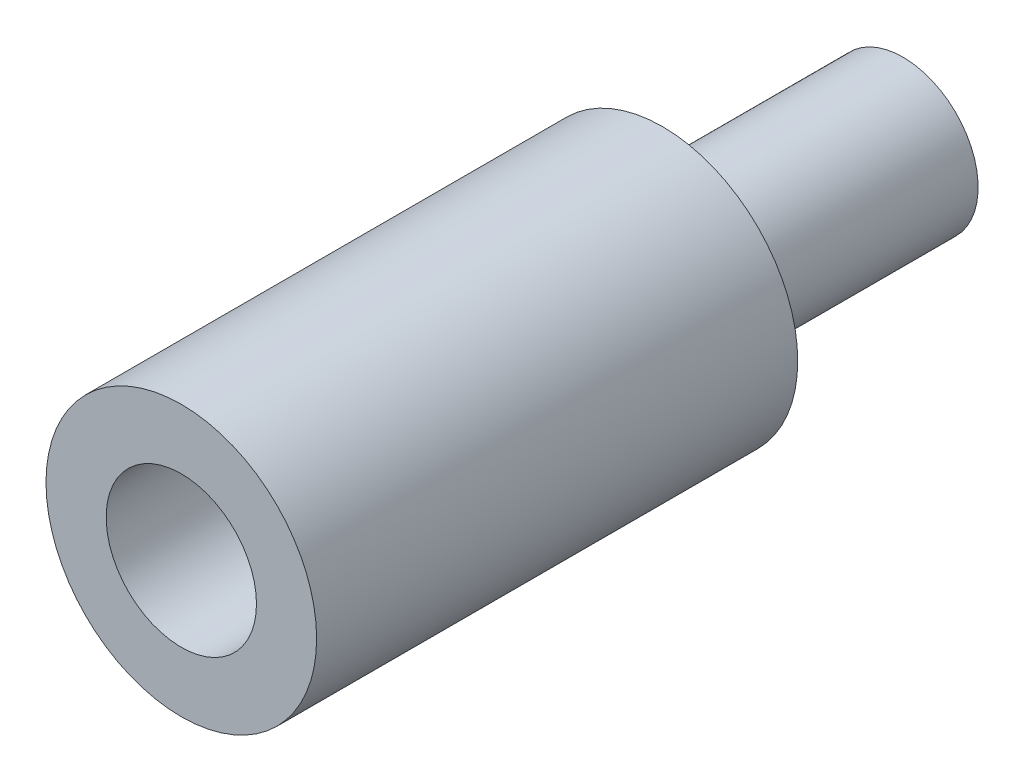
ISO-10303-21;
HEADER;
FILE_DESCRIPTION(('STEP AP214'),'2;1');
FILE_NAME('part.step','',(''),(''),'','','');
FILE_SCHEMA(('AUTOMOTIVE_DESIGN { 1 0 10303 214 1 1 1 1 }'));
ENDSEC;
DATA;
#1=APPLICATION_CONTEXT('core data for automotive mechanical design processes');
#2=APPLICATION_PROTOCOL_DEFINITION('international standard','automotive_design',2000,#1);
#3=PRODUCT_CONTEXT('',#1,'mechanical');
#4=PRODUCT('Part','Part','',(#3));
#5=PRODUCT_RELATED_PRODUCT_CATEGORY('part','',(#4));
#6=PRODUCT_DEFINITION_FORMATION('','',#4);
#7=PRODUCT_DEFINITION_CONTEXT('part definition',#1,'design');
#8=PRODUCT_DEFINITION('design','',#6,#7);
#9=PRODUCT_DEFINITION_SHAPE('','',#8);
#10=(LENGTH_UNIT() NAMED_UNIT(*) SI_UNIT(.MILLI.,.METRE.));
#11=(NAMED_UNIT(*) PLANE_ANGLE_UNIT() SI_UNIT($,.RADIAN.));
#12=(NAMED_UNIT(*) SI_UNIT($,.STERADIAN.) SOLID_ANGLE_UNIT());
#13=UNCERTAINTY_MEASURE_WITH_UNIT(LENGTH_MEASURE(1.E-05),#10,'distance_accuracy_value','');
#14=(GEOMETRIC_REPRESENTATION_CONTEXT(3) GLOBAL_UNCERTAINTY_ASSIGNED_CONTEXT((#13)) GLOBAL_UNIT_ASSIGNED_CONTEXT((#10,
#11,#12)) REPRESENTATION_CONTEXT('',''));
#15=CARTESIAN_POINT('',(0.,0.,0.));
#16=DIRECTION('',(0.,0.,1.));
#17=DIRECTION('',(1.,0.,0.));
#18=AXIS2_PLACEMENT_3D('',#15,#16,#17);
#19=CARTESIAN_POINT('',(0.,0.,-4.));
#20=DIRECTION('',(0.,0.,1.));
#21=DIRECTION('',(1.,0.,0.));
#22=AXIS2_PLACEMENT_3D('',#19,#20,#21);
#23=CYLINDRICAL_SURFACE('',#22,1.25);
#24=CARTESIAN_POINT('',(0.,0.,-4.));
#25=DIRECTION('',(0.,0.,-1.));
#26=DIRECTION('',(-1.,0.,0.));
#27=AXIS2_PLACEMENT_3D('',#24,#25,#26);
#28=CIRCLE('',#27,1.25);
#29=CARTESIAN_POINT('',(-1.25,0.,-4.));
#30=VERTEX_POINT('',#29);
#31=EDGE_CURVE('E11',#30,#30,#28,.T.);
#32=ORIENTED_EDGE('',*,*,#31,.F.);
#33=EDGE_LOOP('',(#32));
#34=FACE_BOUND('',#33,.T.);
#35=CARTESIAN_POINT('',(0.,0.,0.));
#36=DIRECTION('',(0.,0.,-1.));
#37=DIRECTION('',(-1.,0.,0.));
#38=AXIS2_PLACEMENT_3D('',#35,#36,#37);
#39=CIRCLE('',#38,1.25);
#40=CARTESIAN_POINT('',(-1.25,0.,0.));
#41=VERTEX_POINT('',#40);
#42=EDGE_CURVE('E52',#41,#41,#39,.T.);
#43=ORIENTED_EDGE('',*,*,#42,.T.);
#44=EDGE_LOOP('',(#43));
#45=FACE_BOUND('',#44,.T.);
#46=ADVANCED_FACE('F49',(#34,#45),#23,.T.);
#47=CARTESIAN_POINT('',(0.,0.,-4.));
#48=DIRECTION('',(0.,0.,-1.));
#49=DIRECTION('',(-1.,0.,0.));
#50=AXIS2_PLACEMENT_3D('',#47,#48,#49);
#51=PLANE('',#50);
#52=ORIENTED_EDGE('',*,*,#31,.T.);
#53=EDGE_LOOP('',(#52));
#54=FACE_BOUND('',#53,.T.);
#55=ADVANCED_FACE('F64',(#54),#51,.T.);
#56=CARTESIAN_POINT('',(0.,0.,0.));
#57=DIRECTION('',(0.,0.,-1.));
#58=DIRECTION('',(-1.,0.,0.));
#59=AXIS2_PLACEMENT_3D('',#56,#57,#58);
#60=PLANE('',#59);
#61=ORIENTED_EDGE('',*,*,#42,.F.);
#62=EDGE_LOOP('',(#61));
#63=FACE_BOUND('',#62,.T.);
#64=ADVANCED_FACE('F62',(#63),#60,.F.);
#65=CLOSED_SHELL('',(#46,#55,#64));
#66=MANIFOLD_SOLID_BREP('B2',#65);
#67=CARTESIAN_POINT('',(0.,0.,8.));
#68=DIRECTION('',(0.,0.,-1.));
#69=DIRECTION('',(-1.,0.,0.));
#70=AXIS2_PLACEMENT_3D('',#67,#68,#69);
#71=CYLINDRICAL_SURFACE('',#70,2.25);
#72=CARTESIAN_POINT('',(0.,0.,8.));
#73=DIRECTION('',(0.,0.,1.));
#74=DIRECTION('',(1.,0.,0.));
#75=AXIS2_PLACEMENT_3D('',#72,#73,#74);
#76=CIRCLE('',#75,2.25);
#77=CARTESIAN_POINT('',(2.25,0.,8.));
#78=VERTEX_POINT('',#77);
#79=EDGE_CURVE('E48',#78,#78,#76,.T.);
#80=ORIENTED_EDGE('',*,*,#79,.F.);
#81=EDGE_LOOP('',(#80));
#82=FACE_BOUND('',#81,.T.);
#83=CARTESIAN_POINT('',(0.,0.,0.));
#84=DIRECTION('',(0.,0.,1.));
#85=DIRECTION('',(1.,0.,0.));
#86=AXIS2_PLACEMENT_3D('',#83,#84,#85);
#87=CIRCLE('',#86,2.25);
#88=CARTESIAN_POINT('',(2.25,0.,0.));
#89=VERTEX_POINT('',#88);
#90=EDGE_CURVE('E97',#89,#89,#87,.T.);
#91=ORIENTED_EDGE('',*,*,#90,.T.);
#92=EDGE_LOOP('',(#91));
#93=FACE_BOUND('',#92,.T.);
#94=ADVANCED_FACE('F90',(#82,#93),#71,.T.);
#95=CARTESIAN_POINT('',(0.,0.,8.));
#96=DIRECTION('',(0.,0.,1.));
#97=DIRECTION('',(1.,0.,0.));
#98=AXIS2_PLACEMENT_3D('',#95,#96,#97);
#99=PLANE('',#98);
#100=CARTESIAN_POINT('',(0.,0.,8.));
#101=DIRECTION('',(0.,0.,1.));
#102=DIRECTION('',(1.,0.,0.));
#103=AXIS2_PLACEMENT_3D('',#100,#101,#102);
#104=CIRCLE('',#103,1.25);
#105=CARTESIAN_POINT('',(1.25,0.,8.));
#106=VERTEX_POINT('',#105);
#107=EDGE_CURVE('E103',#106,#106,#104,.T.);
#108=ORIENTED_EDGE('',*,*,#107,.F.);
#109=EDGE_LOOP('',(#108));
#110=FACE_BOUND('',#109,.T.);
#111=ORIENTED_EDGE('',*,*,#79,.T.);
#112=EDGE_LOOP('',(#111));
#113=FACE_BOUND('',#112,.T.);
#114=ADVANCED_FACE('F119',(#110,#113),#99,.T.);
#115=CARTESIAN_POINT('',(0.,0.,0.));
#116=DIRECTION('',(0.,0.,1.));
#117=DIRECTION('',(1.,0.,0.));
#118=AXIS2_PLACEMENT_3D('',#115,#116,#117);
#119=PLANE('',#118);
#120=CARTESIAN_POINT('',(0.,0.,0.));
#121=DIRECTION('',(0.,0.,1.));
#122=DIRECTION('',(1.,0.,0.));
#123=AXIS2_PLACEMENT_3D('',#120,#121,#122);
#124=CIRCLE('',#123,1.25);
#125=CARTESIAN_POINT('',(1.25,0.,0.));
#126=VERTEX_POINT('',#125);
#127=EDGE_CURVE('E93',#126,#126,#124,.T.);
#128=ORIENTED_EDGE('',*,*,#127,.T.);
#129=EDGE_LOOP('',(#128));
#130=FACE_BOUND('',#129,.T.);
#131=ORIENTED_EDGE('',*,*,#90,.F.);
#132=EDGE_LOOP('',(#131));
#133=FACE_BOUND('',#132,.T.);
#134=ADVANCED_FACE('F110',(#130,#133),#119,.F.);
#135=CARTESIAN_POINT('',(0.,0.,-7.));
#136=DIRECTION('',(0.,0.,1.));
#137=DIRECTION('',(1.,0.,0.));
#138=AXIS2_PLACEMENT_3D('',#135,#136,#137);
#139=CYLINDRICAL_SURFACE('',#138,1.25);
#140=ORIENTED_EDGE('',*,*,#107,.T.);
#141=EDGE_LOOP('',(#140));
#142=FACE_BOUND('',#141,.T.);
#143=ORIENTED_EDGE('',*,*,#127,.F.);
#144=EDGE_LOOP('',(#143));
#145=FACE_BOUND('',#144,.T.);
#146=ADVANCED_FACE('F113',(#142,#145),#139,.F.);
#147=CLOSED_SHELL('',(#94,#114,#134,#146));
#148=MANIFOLD_SOLID_BREP('B6',#147);
#149=ADVANCED_BREP_SHAPE_REPRESENTATION('',(#18,#66,#148),#14);
#150=SHAPE_DEFINITION_REPRESENTATION(#9,#149);
ENDSEC;
END-ISO-10303-21;
